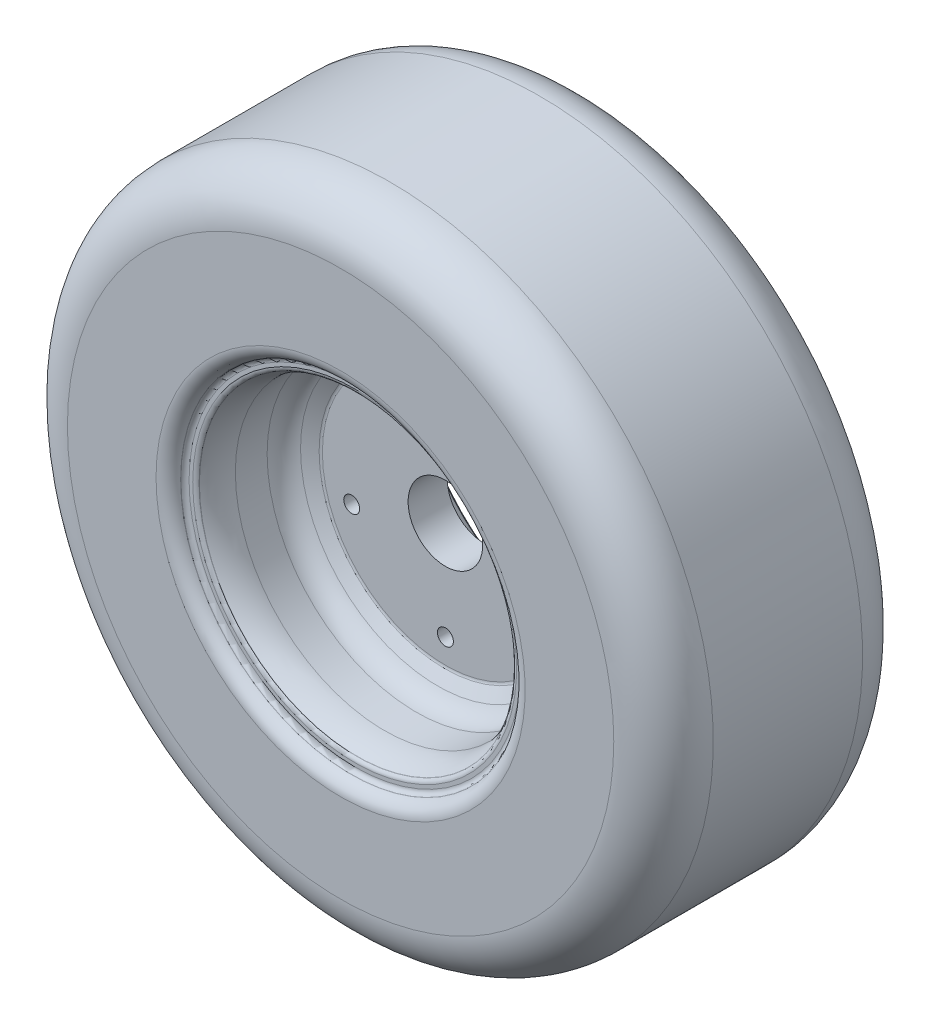
ISO-10303-21;
HEADER;
FILE_DESCRIPTION(('STEP AP214'),'2;1');
FILE_NAME('part.step','',(''),(''),'','','');
FILE_SCHEMA(('AUTOMOTIVE_DESIGN { 1 0 10303 214 1 1 1 1 }'));
ENDSEC;
DATA;
#1=APPLICATION_CONTEXT('core data for automotive mechanical design processes');
#2=APPLICATION_PROTOCOL_DEFINITION('international standard','automotive_design',2000,#1);
#3=PRODUCT_CONTEXT('',#1,'mechanical');
#4=PRODUCT('Part','Part','',(#3));
#5=PRODUCT_RELATED_PRODUCT_CATEGORY('part','',(#4));
#6=PRODUCT_DEFINITION_FORMATION('','',#4);
#7=PRODUCT_DEFINITION_CONTEXT('part definition',#1,'design');
#8=PRODUCT_DEFINITION('design','',#6,#7);
#9=PRODUCT_DEFINITION_SHAPE('','',#8);
#10=(LENGTH_UNIT() NAMED_UNIT(*) SI_UNIT(.MILLI.,.METRE.));
#11=(NAMED_UNIT(*) PLANE_ANGLE_UNIT() SI_UNIT($,.RADIAN.));
#12=(NAMED_UNIT(*) SI_UNIT($,.STERADIAN.) SOLID_ANGLE_UNIT());
#13=UNCERTAINTY_MEASURE_WITH_UNIT(LENGTH_MEASURE(1.E-05),#10,'distance_accuracy_value','');
#14=(GEOMETRIC_REPRESENTATION_CONTEXT(3) GLOBAL_UNCERTAINTY_ASSIGNED_CONTEXT((#13)) GLOBAL_UNIT_ASSIGNED_CONTEXT((#10,
#11,#12)) REPRESENTATION_CONTEXT('',''));
#15=CARTESIAN_POINT('',(0.,0.,0.));
#16=DIRECTION('',(0.,0.,1.));
#17=DIRECTION('',(1.,0.,0.));
#18=AXIS2_PLACEMENT_3D('',#15,#16,#17);
#19=CARTESIAN_POINT('',(0.,0.,-38.1));
#20=DIRECTION('',(0.,0.,-1.));
#21=DIRECTION('',(-1.,0.,0.));
#22=AXIS2_PLACEMENT_3D('',#19,#20,#21);
#23=TOROIDAL_SURFACE('',#22,139.446,25.4);
#24=CARTESIAN_POINT('',(0.,0.,-38.1));
#25=DIRECTION('',(0.,0.,-1.));
#26=DIRECTION('',(-1.,0.,0.));
#27=AXIS2_PLACEMENT_3D('',#24,#25,#26);
#28=CIRCLE('',#27,164.846);
#29=CARTESIAN_POINT('',(-164.846,0.,-38.1));
#30=VERTEX_POINT('',#29);
#31=EDGE_CURVE('E174',#30,#30,#28,.T.);
#32=ORIENTED_EDGE('',*,*,#31,.T.);
#33=EDGE_LOOP('',(#32));
#34=FACE_BOUND('',#33,.T.);
#35=CARTESIAN_POINT('',(0.,0.,-63.5));
#36=DIRECTION('',(0.,0.,-1.));
#37=DIRECTION('',(-1.,0.,0.));
#38=AXIS2_PLACEMENT_3D('',#35,#36,#37);
#39=CIRCLE('',#38,139.446);
#40=CARTESIAN_POINT('',(-139.446,0.,-63.5));
#41=VERTEX_POINT('',#40);
#42=EDGE_CURVE('E171',#41,#41,#39,.T.);
#43=ORIENTED_EDGE('',*,*,#42,.F.);
#44=EDGE_LOOP('',(#43));
#45=FACE_BOUND('',#44,.T.);
#46=ADVANCED_FACE('F38',(#34,#45),#23,.T.);
#47=CARTESIAN_POINT('',(0.,139.446,-63.5));
#48=DIRECTION('',(0.,0.,-1.));
#49=DIRECTION('',(-1.,0.,0.));
#50=AXIS2_PLACEMENT_3D('',#47,#48,#49);
#51=PLANE('',#50);
#52=ORIENTED_EDGE('',*,*,#42,.T.);
#53=EDGE_LOOP('',(#52));
#54=FACE_BOUND('',#53,.T.);
#55=CARTESIAN_POINT('',(0.,0.,-63.5));
#56=DIRECTION('',(0.,0.,-1.));
#57=DIRECTION('',(-1.,0.,0.));
#58=AXIS2_PLACEMENT_3D('',#55,#56,#57);
#59=CIRCLE('',#58,94.2120877153265);
#60=CARTESIAN_POINT('',(-94.2120877153265,0.,-63.5));
#61=VERTEX_POINT('',#60);
#62=EDGE_CURVE('E168',#61,#61,#59,.T.);
#63=ORIENTED_EDGE('',*,*,#62,.F.);
#64=EDGE_LOOP('',(#63));
#65=FACE_BOUND('',#64,.T.);
#66=ADVANCED_FACE('F231',(#54,#65),#51,.T.);
#67=CARTESIAN_POINT('',(0.,0.,-55.88));
#68=DIRECTION('',(0.,0.,-1.));
#69=DIRECTION('',(-1.,0.,0.));
#70=AXIS2_PLACEMENT_3D('',#67,#68,#69);
#71=TOROIDAL_SURFACE('',#70,94.2120877153265,7.62);
#72=ORIENTED_EDGE('',*,*,#62,.T.);
#73=EDGE_LOOP('',(#72));
#74=FACE_BOUND('',#73,.T.);
#75=CARTESIAN_POINT('',(0.,0.,-58.1976065714329));
#76=DIRECTION('',(0.,0.,-1.));
#77=DIRECTION('',(-1.,0.,0.));
#78=AXIS2_PLACEMENT_3D('',#75,#76,#77);
#79=CIRCLE('',#78,86.9530864217565);
#80=CARTESIAN_POINT('',(-86.9530864217565,0.,-58.1976065714329));
#81=VERTEX_POINT('',#80);
#82=EDGE_CURVE('E165',#81,#81,#79,.T.);
#83=ORIENTED_EDGE('',*,*,#82,.F.);
#84=EDGE_LOOP('',(#83));
#85=FACE_BOUND('',#84,.T.);
#86=ADVANCED_FACE('F235',(#74,#85),#71,.T.);
#87=CARTESIAN_POINT('',(0.,0.,-58.1074584761891));
#88=DIRECTION('',(0.,0.,-1.));
#89=DIRECTION('',(-1.,0.,0.));
#90=AXIS2_PLACEMENT_3D('',#87,#88,#89);
#91=CONICAL_SURFACE('',#90,86.9243045260811,0.309043766679178);
#92=ORIENTED_EDGE('',*,*,#82,.T.);
#93=EDGE_LOOP('',(#92));
#94=FACE_BOUND('',#93,.T.);
#95=CARTESIAN_POINT('',(0.,0.,-58.1074584761891));
#96=DIRECTION('',(0.,0.,-1.));
#97=DIRECTION('',(-1.,0.,0.));
#98=AXIS2_PLACEMENT_3D('',#95,#96,#97);
#99=CIRCLE('',#98,86.9243045260811);
#100=CARTESIAN_POINT('',(-86.9243045260811,0.,-58.1074584761891));
#101=VERTEX_POINT('',#100);
#102=EDGE_CURVE('E162',#101,#101,#99,.T.);
#103=ORIENTED_EDGE('',*,*,#102,.F.);
#104=EDGE_LOOP('',(#103));
#105=FACE_BOUND('',#104,.T.);
#106=ADVANCED_FACE('F239',(#94,#105),#91,.F.);
#107=CARTESIAN_POINT('',(0.,0.,-58.879994));
#108=DIRECTION('',(0.,0.,-1.));
#109=DIRECTION('',(-1.,0.,0.));
#110=AXIS2_PLACEMENT_3D('',#107,#108,#109);
#111=TOROIDAL_SURFACE('',#110,84.5046374282244,2.54000000000001);
#112=ORIENTED_EDGE('',*,*,#102,.T.);
#113=EDGE_LOOP('',(#112));
#114=FACE_BOUND('',#113,.T.);
#115=CARTESIAN_POINT('',(0.,0.,-56.339994));
#116=DIRECTION('',(0.,0.,-1.));
#117=DIRECTION('',(-1.,0.,0.));
#118=AXIS2_PLACEMENT_3D('',#115,#116,#117);
#119=CIRCLE('',#118,84.5046374282244);
#120=CARTESIAN_POINT('',(-84.5046374282244,0.,-56.339994));
#121=VERTEX_POINT('',#120);
#122=EDGE_CURVE('E159',#121,#121,#119,.T.);
#123=ORIENTED_EDGE('',*,*,#122,.F.);
#124=EDGE_LOOP('',(#123));
#125=FACE_BOUND('',#124,.T.);
#126=ADVANCED_FACE('F243',(#114,#125),#111,.F.);
#127=CARTESIAN_POINT('',(0.,84.5046374282244,-56.339994));
#128=DIRECTION('',(0.,0.,-1.));
#129=DIRECTION('',(-1.,0.,0.));
#130=AXIS2_PLACEMENT_3D('',#127,#128,#129);
#131=PLANE('',#130);
#132=ORIENTED_EDGE('',*,*,#122,.T.);
#133=EDGE_LOOP('',(#132));
#134=FACE_BOUND('',#133,.T.);
#135=CARTESIAN_POINT('',(0.,0.,-56.339994));
#136=DIRECTION('',(0.,0.,-1.));
#137=DIRECTION('',(-1.,0.,0.));
#138=AXIS2_PLACEMENT_3D('',#135,#136,#137);
#139=CIRCLE('',#138,82.6393667465595);
#140=CARTESIAN_POINT('',(-82.6393667465595,0.,-56.339994));
#141=VERTEX_POINT('',#140);
#142=EDGE_CURVE('E156',#141,#141,#139,.T.);
#143=ORIENTED_EDGE('',*,*,#142,.F.);
#144=EDGE_LOOP('',(#143));
#145=FACE_BOUND('',#144,.T.);
#146=ADVANCED_FACE('F247',(#134,#145),#131,.T.);
#147=CARTESIAN_POINT('',(0.,0.,-53.799994));
#148=DIRECTION('',(0.,0.,-1.));
#149=DIRECTION('',(-1.,0.,0.));
#150=AXIS2_PLACEMENT_3D('',#147,#148,#149);
#151=TOROIDAL_SURFACE('',#150,82.6393667465595,2.53999999999999);
#152=ORIENTED_EDGE('',*,*,#142,.T.);
#153=EDGE_LOOP('',(#152));
#154=FACE_BOUND('',#153,.T.);
#155=CARTESIAN_POINT('',(0.,0.,-55.2089324984121));
#156=DIRECTION('',(0.,0.,-1.));
#157=DIRECTION('',(-1.,0.,0.));
#158=AXIS2_PLACEMENT_3D('',#155,#156,#157);
#159=CIRCLE('',#158,80.5259589989414);
#160=CARTESIAN_POINT('',(-80.5259589989414,0.,-55.2089324984121));
#161=VERTEX_POINT('',#160);
#162=EDGE_CURVE('E153',#161,#161,#159,.T.);
#163=ORIENTED_EDGE('',*,*,#162,.F.);
#164=EDGE_LOOP('',(#163));
#165=FACE_BOUND('',#164,.T.);
#166=ADVANCED_FACE('F251',(#154,#165),#151,.T.);
#167=CARTESIAN_POINT('',(0.,0.,-55.1188777857282));
#168=DIRECTION('',(0.,0.,-1.));
#169=DIRECTION('',(-1.,0.,0.));
#170=AXIS2_PLACEMENT_3D('',#167,#168,#169);
#171=CONICAL_SURFACE('',#170,80.4659225238188,0.588002603547674);
#172=ORIENTED_EDGE('',*,*,#162,.T.);
#173=EDGE_LOOP('',(#172));
#174=FACE_BOUND('',#173,.T.);
#175=CARTESIAN_POINT('',(0.,0.,-55.1188777857282));
#176=DIRECTION('',(0.,0.,-1.));
#177=DIRECTION('',(-1.,0.,0.));
#178=AXIS2_PLACEMENT_3D('',#175,#176,#177);
#179=CIRCLE('',#178,80.4659225238188);
#180=CARTESIAN_POINT('',(-80.4659225238188,0.,-55.1188777857282));
#181=VERTEX_POINT('',#180);
#182=EDGE_CURVE('E150',#181,#181,#179,.T.);
#183=ORIENTED_EDGE('',*,*,#182,.F.);
#184=EDGE_LOOP('',(#183));
#185=FACE_BOUND('',#184,.T.);
#186=ADVANCED_FACE('F255',(#174,#185),#171,.F.);
#187=CARTESIAN_POINT('',(0.,0.,-41.0294928016074));
#188=DIRECTION('',(0.,0.,-1.));
#189=DIRECTION('',(-1.,0.,0.));
#190=AXIS2_PLACEMENT_3D('',#187,#188,#189);
#191=TOROIDAL_SURFACE('',#190,101.6,25.4);
#192=ORIENTED_EDGE('',*,*,#182,.T.);
#193=EDGE_LOOP('',(#192));
#194=FACE_BOUND('',#193,.T.);
#195=CARTESIAN_POINT('',(0.,0.,-41.0294928016074));
#196=DIRECTION('',(0.,0.,-1.));
#197=DIRECTION('',(-1.,0.,0.));
#198=AXIS2_PLACEMENT_3D('',#195,#196,#197);
#199=CIRCLE('',#198,76.2);
#200=CARTESIAN_POINT('',(-76.2,0.,-41.0294928016074));
#201=VERTEX_POINT('',#200);
#202=EDGE_CURVE('E147',#201,#201,#199,.T.);
#203=ORIENTED_EDGE('',*,*,#202,.F.);
#204=EDGE_LOOP('',(#203));
#205=FACE_BOUND('',#204,.T.);
#206=ADVANCED_FACE('F259',(#194,#205),#191,.T.);
#207=CARTESIAN_POINT('',(0.,0.,-76.2));
#208=DIRECTION('',(0.,0.,-1.));
#209=DIRECTION('',(-1.,0.,0.));
#210=AXIS2_PLACEMENT_3D('',#207,#208,#209);
#211=CYLINDRICAL_SURFACE('',#210,76.2);
#212=ORIENTED_EDGE('',*,*,#202,.T.);
#213=EDGE_LOOP('',(#212));
#214=FACE_BOUND('',#213,.T.);
#215=CARTESIAN_POINT('',(0.,0.,-24.8106178129071));
#216=DIRECTION('',(0.,0.,-1.));
#217=DIRECTION('',(-1.,0.,0.));
#218=AXIS2_PLACEMENT_3D('',#215,#216,#217);
#219=CIRCLE('',#218,76.2);
#220=CARTESIAN_POINT('',(-76.2,0.,-24.8106178129071));
#221=VERTEX_POINT('',#220);
#222=EDGE_CURVE('E144',#221,#221,#219,.T.);
#223=ORIENTED_EDGE('',*,*,#222,.F.);
#224=EDGE_LOOP('',(#223));
#225=FACE_BOUND('',#224,.T.);
#226=ADVANCED_FACE('F263',(#214,#225),#211,.F.);
#227=CARTESIAN_POINT('',(0.,0.,-24.8106178129071));
#228=DIRECTION('',(0.,0.,-1.));
#229=DIRECTION('',(-1.,0.,0.));
#230=AXIS2_PLACEMENT_3D('',#227,#228,#229);
#231=TOROIDAL_SURFACE('',#230,63.5,12.7);
#232=ORIENTED_EDGE('',*,*,#222,.T.);
#233=EDGE_LOOP('',(#232));
#234=FACE_BOUND('',#233,.T.);
#235=CARTESIAN_POINT('',(0.,0.,-13.9204576563578));
#236=DIRECTION('',(0.,0.,-1.));
#237=DIRECTION('',(-1.,0.,0.));
#238=AXIS2_PLACEMENT_3D('',#235,#236,#237);
#239=CIRCLE('',#238,70.0340960939296);
#240=CARTESIAN_POINT('',(-70.0340960939296,0.,-13.9204576563578));
#241=VERTEX_POINT('',#240);
#242=EDGE_CURVE('E141',#241,#241,#239,.T.);
#243=ORIENTED_EDGE('',*,*,#242,.F.);
#244=EDGE_LOOP('',(#243));
#245=FACE_BOUND('',#244,.T.);
#246=ADVANCED_FACE('F267',(#234,#245),#231,.F.);
#247=CARTESIAN_POINT('',(0.,0.,-10.3619679686901));
#248=DIRECTION('',(0.,0.,-1.));
#249=DIRECTION('',(-1.,0.,0.));
#250=AXIS2_PLACEMENT_3D('',#247,#248,#249);
#251=CONICAL_SURFACE('',#250,64.1032799478169,1.03037682652431);
#252=ORIENTED_EDGE('',*,*,#242,.T.);
#253=EDGE_LOOP('',(#252));
#254=FACE_BOUND('',#253,.T.);
#255=CARTESIAN_POINT('',(0.,0.,-10.3619679686901));
#256=DIRECTION('',(0.,0.,-1.));
#257=DIRECTION('',(-1.,0.,0.));
#258=AXIS2_PLACEMENT_3D('',#255,#256,#257);
#259=CIRCLE('',#258,64.1032799478169);
#260=CARTESIAN_POINT('',(-64.1032799478169,0.,-10.3619679686901));
#261=VERTEX_POINT('',#260);
#262=EDGE_CURVE('E138',#261,#261,#259,.T.);
#263=ORIENTED_EDGE('',*,*,#262,.F.);
#264=EDGE_LOOP('',(#263));
#265=FACE_BOUND('',#264,.T.);
#266=ADVANCED_FACE('F271',(#254,#265),#251,.F.);
#267=CARTESIAN_POINT('',(0.,0.,-12.54));
#268=DIRECTION('',(0.,0.,-1.));
#269=DIRECTION('',(-1.,0.,0.));
#270=AXIS2_PLACEMENT_3D('',#267,#268,#269);
#271=TOROIDAL_SURFACE('',#270,62.796460729031,2.54);
#272=ORIENTED_EDGE('',*,*,#262,.T.);
#273=EDGE_LOOP('',(#272));
#274=FACE_BOUND('',#273,.T.);
#275=CARTESIAN_POINT('',(0.,0.,-10.));
#276=DIRECTION('',(0.,0.,-1.));
#277=DIRECTION('',(-1.,0.,0.));
#278=AXIS2_PLACEMENT_3D('',#275,#276,#277);
#279=CIRCLE('',#278,62.796460729031);
#280=CARTESIAN_POINT('',(-62.796460729031,0.,-10.));
#281=VERTEX_POINT('',#280);
#282=EDGE_CURVE('E135',#281,#281,#279,.T.);
#283=ORIENTED_EDGE('',*,*,#282,.F.);
#284=EDGE_LOOP('',(#283));
#285=FACE_BOUND('',#284,.T.);
#286=ADVANCED_FACE('F275',(#274,#285),#271,.F.);
#287=CARTESIAN_POINT('',(0.,0.,-10.));
#288=DIRECTION('',(0.,0.,-1.));
#289=DIRECTION('',(-1.,0.,0.));
#290=AXIS2_PLACEMENT_3D('',#287,#288,#289);
#291=PLANE('',#290);
#292=CARTESIAN_POINT('',(-47.8305343175157,-15.5410826811054,-10.));
#293=DIRECTION('',(0.,0.,-1.));
#294=DIRECTION('',(-1.,0.,0.));
#295=AXIS2_PLACEMENT_3D('',#292,#293,#294);
#296=CIRCLE('',#295,4.064);
#297=CARTESIAN_POINT('',(-51.8945343175157,-15.5410826811054,-10.));
#298=VERTEX_POINT('',#297);
#299=EDGE_CURVE('E74',#298,#298,#296,.T.);
#300=ORIENTED_EDGE('',*,*,#299,.F.);
#301=EDGE_LOOP('',(#300));
#302=FACE_BOUND('',#301,.T.);
#303=CARTESIAN_POINT('',(-29.5608959082934,40.6870826811046,-10.));
#304=DIRECTION('',(0.,0.,-1.));
#305=DIRECTION('',(-1.,0.,0.));
#306=AXIS2_PLACEMENT_3D('',#303,#304,#305);
#307=CIRCLE('',#306,4.064);
#308=CARTESIAN_POINT('',(-33.6248959082934,40.6870826811046,-10.));
#309=VERTEX_POINT('',#308);
#310=EDGE_CURVE('E71',#309,#309,#307,.T.);
#311=ORIENTED_EDGE('',*,*,#310,.F.);
#312=EDGE_LOOP('',(#311));
#313=FACE_BOUND('',#312,.T.);
#314=CARTESIAN_POINT('',(29.5608959082928,40.687082681105,-10.));
#315=DIRECTION('',(0.,0.,-1.));
#316=DIRECTION('',(-1.,0.,0.));
#317=AXIS2_PLACEMENT_3D('',#314,#315,#316);
#318=CIRCLE('',#317,4.064);
#319=CARTESIAN_POINT('',(25.4968959082928,40.687082681105,-10.));
#320=VERTEX_POINT('',#319);
#321=EDGE_CURVE('E68',#320,#320,#318,.T.);
#322=ORIENTED_EDGE('',*,*,#321,.F.);
#323=EDGE_LOOP('',(#322));
#324=FACE_BOUND('',#323,.T.);
#325=CARTESIAN_POINT('',(47.8305343175159,-15.5410826811047,-10.));
#326=DIRECTION('',(0.,0.,-1.));
#327=DIRECTION('',(-1.,0.,0.));
#328=AXIS2_PLACEMENT_3D('',#325,#326,#327);
#329=CIRCLE('',#328,4.064);
#330=CARTESIAN_POINT('',(43.7665343175159,-15.5410826811047,-10.));
#331=VERTEX_POINT('',#330);
#332=EDGE_CURVE('E64',#331,#331,#329,.T.);
#333=ORIENTED_EDGE('',*,*,#332,.F.);
#334=EDGE_LOOP('',(#333));
#335=FACE_BOUND('',#334,.T.);
#336=CARTESIAN_POINT('',(0.,-50.292,-10.));
#337=DIRECTION('',(0.,0.,-1.));
#338=DIRECTION('',(-1.,0.,0.));
#339=AXIS2_PLACEMENT_3D('',#336,#337,#338);
#340=CIRCLE('',#339,4.064);
#341=CARTESIAN_POINT('',(-4.064,-50.292,-10.));
#342=VERTEX_POINT('',#341);
#343=EDGE_CURVE('E60',#342,#342,#340,.T.);
#344=ORIENTED_EDGE('',*,*,#343,.F.);
#345=EDGE_LOOP('',(#344));
#346=FACE_BOUND('',#345,.T.);
#347=CARTESIAN_POINT('',(0.,0.,-10.));
#348=DIRECTION('',(0.,0.,-1.));
#349=DIRECTION('',(-1.,0.,0.));
#350=AXIS2_PLACEMENT_3D('',#347,#348,#349);
#351=CIRCLE('',#350,19.05);
#352=CARTESIAN_POINT('',(-19.05,0.,-10.));
#353=VERTEX_POINT('',#352);
#354=EDGE_CURVE('E59',#353,#353,#351,.T.);
#355=ORIENTED_EDGE('',*,*,#354,.F.);
#356=EDGE_LOOP('',(#355));
#357=FACE_BOUND('',#356,.T.);
#358=ORIENTED_EDGE('',*,*,#282,.T.);
#359=EDGE_LOOP('',(#358));
#360=FACE_BOUND('',#359,.T.);
#361=ADVANCED_FACE('F279',(#302,#313,#324,#335,#346,#357,#360),#291,.T.);
#362=CARTESIAN_POINT('',(0.,0.,9.99999999999999));
#363=DIRECTION('',(0.,0.,1.));
#364=DIRECTION('',(1.,0.,0.));
#365=AXIS2_PLACEMENT_3D('',#362,#363,#364);
#366=PLANE('',#365);
#367=CARTESIAN_POINT('',(-47.8305343175157,-15.5410826811054,9.99999999999999));
#368=DIRECTION('',(0.,0.,1.));
#369=DIRECTION('',(1.,0.,0.));
#370=AXIS2_PLACEMENT_3D('',#367,#368,#369);
#371=CIRCLE('',#370,4.064);
#372=CARTESIAN_POINT('',(-43.7665343175157,-15.5410826811054,9.99999999999999));
#373=VERTEX_POINT('',#372);
#374=EDGE_CURVE('E42',#373,#373,#371,.T.);
#375=ORIENTED_EDGE('',*,*,#374,.F.);
#376=EDGE_LOOP('',(#375));
#377=FACE_BOUND('',#376,.T.);
#378=CARTESIAN_POINT('',(-29.5608959082934,40.6870826811046,9.99999999999999));
#379=DIRECTION('',(0.,0.,1.));
#380=DIRECTION('',(1.,0.,0.));
#381=AXIS2_PLACEMENT_3D('',#378,#379,#380);
#382=CIRCLE('',#381,4.064);
#383=CARTESIAN_POINT('',(-25.4968959082934,40.6870826811046,9.99999999999999));
#384=VERTEX_POINT('',#383);
#385=EDGE_CURVE('E72',#384,#384,#382,.T.);
#386=ORIENTED_EDGE('',*,*,#385,.F.);
#387=EDGE_LOOP('',(#386));
#388=FACE_BOUND('',#387,.T.);
#389=CARTESIAN_POINT('',(29.5608959082928,40.687082681105,9.99999999999999));
#390=DIRECTION('',(0.,0.,1.));
#391=DIRECTION('',(1.,0.,0.));
#392=AXIS2_PLACEMENT_3D('',#389,#390,#391);
#393=CIRCLE('',#392,4.064);
#394=CARTESIAN_POINT('',(33.6248959082928,40.687082681105,9.99999999999999));
#395=VERTEX_POINT('',#394);
#396=EDGE_CURVE('E69',#395,#395,#393,.T.);
#397=ORIENTED_EDGE('',*,*,#396,.F.);
#398=EDGE_LOOP('',(#397));
#399=FACE_BOUND('',#398,.T.);
#400=CARTESIAN_POINT('',(47.8305343175159,-15.5410826811047,9.99999999999999));
#401=DIRECTION('',(0.,0.,1.));
#402=DIRECTION('',(1.,0.,0.));
#403=AXIS2_PLACEMENT_3D('',#400,#401,#402);
#404=CIRCLE('',#403,4.064);
#405=CARTESIAN_POINT('',(51.8945343175159,-15.5410826811047,9.99999999999999));
#406=VERTEX_POINT('',#405);
#407=EDGE_CURVE('E65',#406,#406,#404,.T.);
#408=ORIENTED_EDGE('',*,*,#407,.F.);
#409=EDGE_LOOP('',(#408));
#410=FACE_BOUND('',#409,.T.);
#411=CARTESIAN_POINT('',(0.,-50.292,9.99999999999999));
#412=DIRECTION('',(0.,0.,1.));
#413=DIRECTION('',(1.,0.,0.));
#414=AXIS2_PLACEMENT_3D('',#411,#412,#413);
#415=CIRCLE('',#414,4.064);
#416=CARTESIAN_POINT('',(4.064,-50.292,9.99999999999999));
#417=VERTEX_POINT('',#416);
#418=EDGE_CURVE('E61',#417,#417,#415,.T.);
#419=ORIENTED_EDGE('',*,*,#418,.F.);
#420=EDGE_LOOP('',(#419));
#421=FACE_BOUND('',#420,.T.);
#422=CARTESIAN_POINT('',(0.,0.,9.99999999999999));
#423=DIRECTION('',(0.,0.,1.));
#424=DIRECTION('',(1.,0.,0.));
#425=AXIS2_PLACEMENT_3D('',#422,#423,#424);
#426=CIRCLE('',#425,19.05);
#427=CARTESIAN_POINT('',(19.05,0.,9.99999999999999));
#428=VERTEX_POINT('',#427);
#429=EDGE_CURVE('E56',#428,#428,#426,.T.);
#430=ORIENTED_EDGE('',*,*,#429,.F.);
#431=EDGE_LOOP('',(#430));
#432=FACE_BOUND('',#431,.T.);
#433=CARTESIAN_POINT('',(0.,0.,9.99999999999999));
#434=DIRECTION('',(0.,0.,-1.));
#435=DIRECTION('',(-1.,0.,0.));
#436=AXIS2_PLACEMENT_3D('',#433,#434,#435);
#437=CIRCLE('',#436,62.796460729031);
#438=CARTESIAN_POINT('',(-62.796460729031,0.,9.99999999999999));
#439=VERTEX_POINT('',#438);
#440=EDGE_CURVE('E132',#439,#439,#437,.T.);
#441=ORIENTED_EDGE('',*,*,#440,.F.);
#442=EDGE_LOOP('',(#441));
#443=FACE_BOUND('',#442,.T.);
#444=ADVANCED_FACE('F283',(#377,#388,#399,#410,#421,#432,#443),#366,.T.);
#445=CARTESIAN_POINT('',(0.,0.,12.54));
#446=DIRECTION('',(0.,0.,-1.));
#447=DIRECTION('',(-1.,0.,0.));
#448=AXIS2_PLACEMENT_3D('',#445,#446,#447);
#449=TOROIDAL_SURFACE('',#448,62.796460729031,2.54);
#450=ORIENTED_EDGE('',*,*,#440,.T.);
#451=EDGE_LOOP('',(#450));
#452=FACE_BOUND('',#451,.T.);
#453=CARTESIAN_POINT('',(0.,0.,10.3619679686901));
#454=DIRECTION('',(0.,0.,-1.));
#455=DIRECTION('',(-1.,0.,0.));
#456=AXIS2_PLACEMENT_3D('',#453,#454,#455);
#457=CIRCLE('',#456,64.1032799478169);
#458=CARTESIAN_POINT('',(-64.1032799478169,0.,10.3619679686901));
#459=VERTEX_POINT('',#458);
#460=EDGE_CURVE('E129',#459,#459,#457,.T.);
#461=ORIENTED_EDGE('',*,*,#460,.F.);
#462=EDGE_LOOP('',(#461));
#463=FACE_BOUND('',#462,.T.);
#464=ADVANCED_FACE('F287',(#452,#463),#449,.F.);
#465=CARTESIAN_POINT('',(0.,0.,13.9204576563577));
#466=DIRECTION('',(0.,0.,1.));
#467=DIRECTION('',(1.,0.,0.));
#468=AXIS2_PLACEMENT_3D('',#465,#466,#467);
#469=CONICAL_SURFACE('',#468,70.0340960939296,1.03037682652431);
#470=ORIENTED_EDGE('',*,*,#460,.T.);
#471=EDGE_LOOP('',(#470));
#472=FACE_BOUND('',#471,.T.);
#473=CARTESIAN_POINT('',(0.,0.,13.9204576563577));
#474=DIRECTION('',(0.,0.,-1.));
#475=DIRECTION('',(-1.,0.,0.));
#476=AXIS2_PLACEMENT_3D('',#473,#474,#475);
#477=CIRCLE('',#476,70.0340960939296);
#478=CARTESIAN_POINT('',(-70.0340960939296,0.,13.9204576563577));
#479=VERTEX_POINT('',#478);
#480=EDGE_CURVE('E126',#479,#479,#477,.T.);
#481=ORIENTED_EDGE('',*,*,#480,.F.);
#482=EDGE_LOOP('',(#481));
#483=FACE_BOUND('',#482,.T.);
#484=ADVANCED_FACE('F291',(#472,#483),#469,.F.);
#485=CARTESIAN_POINT('',(0.,0.,24.810617812907));
#486=DIRECTION('',(0.,0.,-1.));
#487=DIRECTION('',(-1.,0.,0.));
#488=AXIS2_PLACEMENT_3D('',#485,#486,#487);
#489=TOROIDAL_SURFACE('',#488,63.5,12.7);
#490=ORIENTED_EDGE('',*,*,#480,.T.);
#491=EDGE_LOOP('',(#490));
#492=FACE_BOUND('',#491,.T.);
#493=CARTESIAN_POINT('',(0.,0.,24.8106178129071));
#494=DIRECTION('',(0.,0.,-1.));
#495=DIRECTION('',(-1.,0.,0.));
#496=AXIS2_PLACEMENT_3D('',#493,#494,#495);
#497=CIRCLE('',#496,76.2);
#498=CARTESIAN_POINT('',(-76.2,0.,24.8106178129071));
#499=VERTEX_POINT('',#498);
#500=EDGE_CURVE('E123',#499,#499,#497,.T.);
#501=ORIENTED_EDGE('',*,*,#500,.F.);
#502=EDGE_LOOP('',(#501));
#503=FACE_BOUND('',#502,.T.);
#504=ADVANCED_FACE('F295',(#492,#503),#489,.F.);
#505=CARTESIAN_POINT('',(0.,0.,-76.2));
#506=DIRECTION('',(0.,0.,-1.));
#507=DIRECTION('',(-1.,0.,0.));
#508=AXIS2_PLACEMENT_3D('',#505,#506,#507);
#509=CYLINDRICAL_SURFACE('',#508,76.2);
#510=ORIENTED_EDGE('',*,*,#500,.T.);
#511=EDGE_LOOP('',(#510));
#512=FACE_BOUND('',#511,.T.);
#513=CARTESIAN_POINT('',(0.,0.,41.0294928016074));
#514=DIRECTION('',(0.,0.,-1.));
#515=DIRECTION('',(-1.,0.,0.));
#516=AXIS2_PLACEMENT_3D('',#513,#514,#515);
#517=CIRCLE('',#516,76.2);
#518=CARTESIAN_POINT('',(-76.2,0.,41.0294928016074));
#519=VERTEX_POINT('',#518);
#520=EDGE_CURVE('E120',#519,#519,#517,.T.);
#521=ORIENTED_EDGE('',*,*,#520,.F.);
#522=EDGE_LOOP('',(#521));
#523=FACE_BOUND('',#522,.T.);
#524=ADVANCED_FACE('F299',(#512,#523),#509,.F.);
#525=CARTESIAN_POINT('',(0.,0.,41.0294928016074));
#526=DIRECTION('',(0.,0.,-1.));
#527=DIRECTION('',(-1.,0.,0.));
#528=AXIS2_PLACEMENT_3D('',#525,#526,#527);
#529=TOROIDAL_SURFACE('',#528,101.6,25.4);
#530=ORIENTED_EDGE('',*,*,#520,.T.);
#531=EDGE_LOOP('',(#530));
#532=FACE_BOUND('',#531,.T.);
#533=CARTESIAN_POINT('',(0.,0.,55.1188777857282));
#534=DIRECTION('',(0.,0.,-1.));
#535=DIRECTION('',(-1.,0.,0.));
#536=AXIS2_PLACEMENT_3D('',#533,#534,#535);
#537=CIRCLE('',#536,80.4659225238188);
#538=CARTESIAN_POINT('',(-80.4659225238188,0.,55.1188777857282));
#539=VERTEX_POINT('',#538);
#540=EDGE_CURVE('E117',#539,#539,#537,.T.);
#541=ORIENTED_EDGE('',*,*,#540,.F.);
#542=EDGE_LOOP('',(#541));
#543=FACE_BOUND('',#542,.T.);
#544=ADVANCED_FACE('F303',(#532,#543),#529,.T.);
#545=CARTESIAN_POINT('',(0.,0.,55.2089324984121));
#546=DIRECTION('',(0.,0.,1.));
#547=DIRECTION('',(1.,0.,0.));
#548=AXIS2_PLACEMENT_3D('',#545,#546,#547);
#549=CONICAL_SURFACE('',#548,80.5259589989414,0.58800260354771);
#550=ORIENTED_EDGE('',*,*,#540,.T.);
#551=EDGE_LOOP('',(#550));
#552=FACE_BOUND('',#551,.T.);
#553=CARTESIAN_POINT('',(0.,0.,55.2089324984121));
#554=DIRECTION('',(0.,0.,-1.));
#555=DIRECTION('',(-1.,0.,0.));
#556=AXIS2_PLACEMENT_3D('',#553,#554,#555);
#557=CIRCLE('',#556,80.5259589989414);
#558=CARTESIAN_POINT('',(-80.5259589989414,0.,55.2089324984121));
#559=VERTEX_POINT('',#558);
#560=EDGE_CURVE('E114',#559,#559,#557,.T.);
#561=ORIENTED_EDGE('',*,*,#560,.F.);
#562=EDGE_LOOP('',(#561));
#563=FACE_BOUND('',#562,.T.);
#564=ADVANCED_FACE('F307',(#552,#563),#549,.F.);
#565=CARTESIAN_POINT('',(0.,0.,53.799994));
#566=DIRECTION('',(0.,0.,-1.));
#567=DIRECTION('',(-1.,0.,0.));
#568=AXIS2_PLACEMENT_3D('',#565,#566,#567);
#569=TOROIDAL_SURFACE('',#568,82.6393667465595,2.54);
#570=ORIENTED_EDGE('',*,*,#560,.T.);
#571=EDGE_LOOP('',(#570));
#572=FACE_BOUND('',#571,.T.);
#573=CARTESIAN_POINT('',(0.,0.,56.339994));
#574=DIRECTION('',(0.,0.,-1.));
#575=DIRECTION('',(-1.,0.,0.));
#576=AXIS2_PLACEMENT_3D('',#573,#574,#575);
#577=CIRCLE('',#576,82.6393667465595);
#578=CARTESIAN_POINT('',(-82.6393667465595,0.,56.339994));
#579=VERTEX_POINT('',#578);
#580=EDGE_CURVE('E111',#579,#579,#577,.T.);
#581=ORIENTED_EDGE('',*,*,#580,.F.);
#582=EDGE_LOOP('',(#581));
#583=FACE_BOUND('',#582,.T.);
#584=ADVANCED_FACE('F311',(#572,#583),#569,.T.);
#585=CARTESIAN_POINT('',(0.,84.5046374282244,56.339994));
#586=DIRECTION('',(0.,0.,1.));
#587=DIRECTION('',(1.,0.,0.));
#588=AXIS2_PLACEMENT_3D('',#585,#586,#587);
#589=PLANE('',#588);
#590=ORIENTED_EDGE('',*,*,#580,.T.);
#591=EDGE_LOOP('',(#590));
#592=FACE_BOUND('',#591,.T.);
#593=CARTESIAN_POINT('',(0.,0.,56.339994));
#594=DIRECTION('',(0.,0.,-1.));
#595=DIRECTION('',(-1.,0.,0.));
#596=AXIS2_PLACEMENT_3D('',#593,#594,#595);
#597=CIRCLE('',#596,84.5046374282244);
#598=CARTESIAN_POINT('',(-84.5046374282244,0.,56.339994));
#599=VERTEX_POINT('',#598);
#600=EDGE_CURVE('E108',#599,#599,#597,.T.);
#601=ORIENTED_EDGE('',*,*,#600,.F.);
#602=EDGE_LOOP('',(#601));
#603=FACE_BOUND('',#602,.T.);
#604=ADVANCED_FACE('F315',(#592,#603),#589,.T.);
#605=CARTESIAN_POINT('',(0.,0.,58.879994));
#606=DIRECTION('',(0.,0.,-1.));
#607=DIRECTION('',(-1.,0.,0.));
#608=AXIS2_PLACEMENT_3D('',#605,#606,#607);
#609=TOROIDAL_SURFACE('',#608,84.5046374282244,2.54000000000001);
#610=ORIENTED_EDGE('',*,*,#600,.T.);
#611=EDGE_LOOP('',(#610));
#612=FACE_BOUND('',#611,.T.);
#613=CARTESIAN_POINT('',(0.,0.,58.107458476189));
#614=DIRECTION('',(0.,0.,-1.));
#615=DIRECTION('',(-1.,0.,0.));
#616=AXIS2_PLACEMENT_3D('',#613,#614,#615);
#617=CIRCLE('',#616,86.9243045260811);
#618=CARTESIAN_POINT('',(-86.9243045260811,0.,58.107458476189));
#619=VERTEX_POINT('',#618);
#620=EDGE_CURVE('E105',#619,#619,#617,.T.);
#621=ORIENTED_EDGE('',*,*,#620,.F.);
#622=EDGE_LOOP('',(#621));
#623=FACE_BOUND('',#622,.T.);
#624=ADVANCED_FACE('F319',(#612,#623),#609,.F.);
#625=CARTESIAN_POINT('',(0.,0.,58.1976065714328));
#626=DIRECTION('',(0.,0.,1.));
#627=DIRECTION('',(1.,0.,0.));
#628=AXIS2_PLACEMENT_3D('',#625,#626,#627);
#629=CONICAL_SURFACE('',#628,86.9530864217565,0.309043766679082);
#630=ORIENTED_EDGE('',*,*,#620,.T.);
#631=EDGE_LOOP('',(#630));
#632=FACE_BOUND('',#631,.T.);
#633=CARTESIAN_POINT('',(0.,0.,58.1976065714328));
#634=DIRECTION('',(0.,0.,-1.));
#635=DIRECTION('',(-1.,0.,0.));
#636=AXIS2_PLACEMENT_3D('',#633,#634,#635);
#637=CIRCLE('',#636,86.9530864217565);
#638=CARTESIAN_POINT('',(-86.9530864217565,0.,58.1976065714328));
#639=VERTEX_POINT('',#638);
#640=EDGE_CURVE('E102',#639,#639,#637,.T.);
#641=ORIENTED_EDGE('',*,*,#640,.F.);
#642=EDGE_LOOP('',(#641));
#643=FACE_BOUND('',#642,.T.);
#644=ADVANCED_FACE('F323',(#632,#643),#629,.F.);
#645=CARTESIAN_POINT('',(0.,0.,55.88));
#646=DIRECTION('',(0.,0.,-1.));
#647=DIRECTION('',(-1.,0.,0.));
#648=AXIS2_PLACEMENT_3D('',#645,#646,#647);
#649=TOROIDAL_SURFACE('',#648,94.2120877153265,7.61999999999999);
#650=ORIENTED_EDGE('',*,*,#640,.T.);
#651=EDGE_LOOP('',(#650));
#652=FACE_BOUND('',#651,.T.);
#653=CARTESIAN_POINT('',(0.,0.,63.5));
#654=DIRECTION('',(0.,0.,-1.));
#655=DIRECTION('',(-1.,0.,0.));
#656=AXIS2_PLACEMENT_3D('',#653,#654,#655);
#657=CIRCLE('',#656,94.2120877153265);
#658=CARTESIAN_POINT('',(-94.2120877153265,0.,63.5));
#659=VERTEX_POINT('',#658);
#660=EDGE_CURVE('E99',#659,#659,#657,.T.);
#661=ORIENTED_EDGE('',*,*,#660,.F.);
#662=EDGE_LOOP('',(#661));
#663=FACE_BOUND('',#662,.T.);
#664=ADVANCED_FACE('F327',(#652,#663),#649,.T.);
#665=CARTESIAN_POINT('',(0.,139.446,63.5));
#666=DIRECTION('',(0.,0.,1.));
#667=DIRECTION('',(1.,0.,0.));
#668=AXIS2_PLACEMENT_3D('',#665,#666,#667);
#669=PLANE('',#668);
#670=ORIENTED_EDGE('',*,*,#660,.T.);
#671=EDGE_LOOP('',(#670));
#672=FACE_BOUND('',#671,.T.);
#673=CARTESIAN_POINT('',(0.,0.,63.5));
#674=DIRECTION('',(0.,0.,-1.));
#675=DIRECTION('',(-1.,0.,0.));
#676=AXIS2_PLACEMENT_3D('',#673,#674,#675);
#677=CIRCLE('',#676,139.446);
#678=CARTESIAN_POINT('',(-139.446,0.,63.5));
#679=VERTEX_POINT('',#678);
#680=EDGE_CURVE('E96',#679,#679,#677,.T.);
#681=ORIENTED_EDGE('',*,*,#680,.F.);
#682=EDGE_LOOP('',(#681));
#683=FACE_BOUND('',#682,.T.);
#684=ADVANCED_FACE('F331',(#672,#683),#669,.T.);
#685=CARTESIAN_POINT('',(0.,0.,38.1));
#686=DIRECTION('',(0.,0.,-1.));
#687=DIRECTION('',(-1.,0.,0.));
#688=AXIS2_PLACEMENT_3D('',#685,#686,#687);
#689=TOROIDAL_SURFACE('',#688,139.446,25.4);
#690=ORIENTED_EDGE('',*,*,#680,.T.);
#691=EDGE_LOOP('',(#690));
#692=FACE_BOUND('',#691,.T.);
#693=CARTESIAN_POINT('',(0.,0.,38.1));
#694=DIRECTION('',(0.,0.,-1.));
#695=DIRECTION('',(-1.,0.,0.));
#696=AXIS2_PLACEMENT_3D('',#693,#694,#695);
#697=CIRCLE('',#696,164.846);
#698=CARTESIAN_POINT('',(-164.846,0.,38.1));
#699=VERTEX_POINT('',#698);
#700=EDGE_CURVE('E93',#699,#699,#697,.T.);
#701=ORIENTED_EDGE('',*,*,#700,.F.);
#702=EDGE_LOOP('',(#701));
#703=FACE_BOUND('',#702,.T.);
#704=ADVANCED_FACE('F335',(#692,#703),#689,.T.);
#705=CARTESIAN_POINT('',(0.,0.,-76.2));
#706=DIRECTION('',(0.,0.,-1.));
#707=DIRECTION('',(-1.,0.,0.));
#708=AXIS2_PLACEMENT_3D('',#705,#706,#707);
#709=CYLINDRICAL_SURFACE('',#708,164.846);
#710=ORIENTED_EDGE('',*,*,#700,.T.);
#711=EDGE_LOOP('',(#710));
#712=FACE_BOUND('',#711,.T.);
#713=ORIENTED_EDGE('',*,*,#31,.F.);
#714=EDGE_LOOP('',(#713));
#715=FACE_BOUND('',#714,.T.);
#716=ADVANCED_FACE('F339',(#712,#715),#709,.T.);
#717=CARTESIAN_POINT('',(0.,0.,63.5));
#718=DIRECTION('',(0.,0.,-1.));
#719=DIRECTION('',(-1.,0.,0.));
#720=AXIS2_PLACEMENT_3D('',#717,#718,#719);
#721=CYLINDRICAL_SURFACE('',#720,19.05);
#722=ORIENTED_EDGE('',*,*,#354,.T.);
#723=EDGE_LOOP('',(#722));
#724=FACE_BOUND('',#723,.T.);
#725=ORIENTED_EDGE('',*,*,#429,.T.);
#726=EDGE_LOOP('',(#725));
#727=FACE_BOUND('',#726,.T.);
#728=ADVANCED_FACE('F343',(#724,#727),#721,.F.);
#729=CARTESIAN_POINT('',(0.,-50.292,63.5));
#730=DIRECTION('',(0.,0.,-1.));
#731=DIRECTION('',(-1.,0.,0.));
#732=AXIS2_PLACEMENT_3D('',#729,#730,#731);
#733=CYLINDRICAL_SURFACE('',#732,4.064);
#734=ORIENTED_EDGE('',*,*,#343,.T.);
#735=EDGE_LOOP('',(#734));
#736=FACE_BOUND('',#735,.T.);
#737=ORIENTED_EDGE('',*,*,#418,.T.);
#738=EDGE_LOOP('',(#737));
#739=FACE_BOUND('',#738,.T.);
#740=ADVANCED_FACE('F347',(#736,#739),#733,.F.);
#741=CARTESIAN_POINT('',(47.8305343175159,-15.5410826811047,63.5));
#742=DIRECTION('',(0.,0.,-1.));
#743=DIRECTION('',(-1.,0.,0.));
#744=AXIS2_PLACEMENT_3D('',#741,#742,#743);
#745=CYLINDRICAL_SURFACE('',#744,4.064);
#746=ORIENTED_EDGE('',*,*,#332,.T.);
#747=EDGE_LOOP('',(#746));
#748=FACE_BOUND('',#747,.T.);
#749=ORIENTED_EDGE('',*,*,#407,.T.);
#750=EDGE_LOOP('',(#749));
#751=FACE_BOUND('',#750,.T.);
#752=ADVANCED_FACE('F351',(#748,#751),#745,.F.);
#753=CARTESIAN_POINT('',(29.5608959082928,40.687082681105,63.5));
#754=DIRECTION('',(0.,0.,-1.));
#755=DIRECTION('',(-1.,0.,0.));
#756=AXIS2_PLACEMENT_3D('',#753,#754,#755);
#757=CYLINDRICAL_SURFACE('',#756,4.064);
#758=ORIENTED_EDGE('',*,*,#321,.T.);
#759=EDGE_LOOP('',(#758));
#760=FACE_BOUND('',#759,.T.);
#761=ORIENTED_EDGE('',*,*,#396,.T.);
#762=EDGE_LOOP('',(#761));
#763=FACE_BOUND('',#762,.T.);
#764=ADVANCED_FACE('F355',(#760,#763),#757,.F.);
#765=CARTESIAN_POINT('',(-29.5608959082934,40.6870826811046,63.5));
#766=DIRECTION('',(0.,0.,-1.));
#767=DIRECTION('',(-1.,0.,0.));
#768=AXIS2_PLACEMENT_3D('',#765,#766,#767);
#769=CYLINDRICAL_SURFACE('',#768,4.064);
#770=ORIENTED_EDGE('',*,*,#310,.T.);
#771=EDGE_LOOP('',(#770));
#772=FACE_BOUND('',#771,.T.);
#773=ORIENTED_EDGE('',*,*,#385,.T.);
#774=EDGE_LOOP('',(#773));
#775=FACE_BOUND('',#774,.T.);
#776=ADVANCED_FACE('F359',(#772,#775),#769,.F.);
#777=CARTESIAN_POINT('',(-47.8305343175157,-15.5410826811054,63.5));
#778=DIRECTION('',(0.,0.,-1.));
#779=DIRECTION('',(-1.,0.,0.));
#780=AXIS2_PLACEMENT_3D('',#777,#778,#779);
#781=CYLINDRICAL_SURFACE('',#780,4.064);
#782=ORIENTED_EDGE('',*,*,#299,.T.);
#783=EDGE_LOOP('',(#782));
#784=FACE_BOUND('',#783,.T.);
#785=ORIENTED_EDGE('',*,*,#374,.T.);
#786=EDGE_LOOP('',(#785));
#787=FACE_BOUND('',#786,.T.);
#788=ADVANCED_FACE('F363',(#784,#787),#781,.F.);
#789=CLOSED_SHELL('',(#46,#66,#86,#106,#126,#146,#166,#186,#206,#226,#246,#266,#286,#361,#444,
#464,#484,#504,#524,#544,#564,#584,#604,#624,#644,#664,#684,#704,#716,#728,#740,#752,#764,#776,#788));
#790=CARTESIAN_POINT('',(0.,0.,40.18));
#791=DIRECTION('',(0.,0.,-1.));
#792=DIRECTION('',(-1.,0.,0.));
#793=AXIS2_PLACEMENT_3D('',#790,#791,#792);
#794=TOROIDAL_SURFACE('',#793,100.845958998941,20.32);
#795=CARTESIAN_POINT('',(0.,0.,40.18));
#796=DIRECTION('',(0.,0.,-1.));
#797=DIRECTION('',(-1.,0.,0.));
#798=AXIS2_PLACEMENT_3D('',#795,#796,#797);
#799=CIRCLE('',#798,80.5259589989414);
#800=CARTESIAN_POINT('',(-80.5259589989414,0.,40.18));
#801=VERTEX_POINT('',#800);
#802=EDGE_CURVE('E10',#801,#801,#799,.T.);
#803=ORIENTED_EDGE('',*,*,#802,.F.);
#804=EDGE_LOOP('',(#803));
#805=FACE_BOUND('',#804,.T.);
#806=CARTESIAN_POINT('',(0.,0.,60.5));
#807=DIRECTION('',(0.,0.,-1.));
#808=DIRECTION('',(-1.,0.,0.));
#809=AXIS2_PLACEMENT_3D('',#806,#807,#808);
#810=CIRCLE('',#809,100.845958998941);
#811=CARTESIAN_POINT('',(-100.845958998941,0.,60.5));
#812=VERTEX_POINT('',#811);
#813=EDGE_CURVE('E177',#812,#812,#810,.T.);
#814=ORIENTED_EDGE('',*,*,#813,.T.);
#815=EDGE_LOOP('',(#814));
#816=FACE_BOUND('',#815,.T.);
#817=ADVANCED_FACE('F40',(#805,#816),#794,.F.);
#818=CARTESIAN_POINT('',(0.,0.,-76.2));
#819=DIRECTION('',(0.,0.,-1.));
#820=DIRECTION('',(-1.,0.,0.));
#821=AXIS2_PLACEMENT_3D('',#818,#819,#820);
#822=CYLINDRICAL_SURFACE('',#821,80.5259589989414);
#823=CARTESIAN_POINT('',(0.,0.,-40.18));
#824=DIRECTION('',(0.,0.,-1.));
#825=DIRECTION('',(-1.,0.,0.));
#826=AXIS2_PLACEMENT_3D('',#823,#824,#825);
#827=CIRCLE('',#826,80.5259589989414);
#828=CARTESIAN_POINT('',(-80.5259589989414,0.,-40.18));
#829=VERTEX_POINT('',#828);
#830=EDGE_CURVE('E47',#829,#829,#827,.T.);
#831=ORIENTED_EDGE('',*,*,#830,.F.);
#832=EDGE_LOOP('',(#831));
#833=FACE_BOUND('',#832,.T.);
#834=ORIENTED_EDGE('',*,*,#802,.T.);
#835=EDGE_LOOP('',(#834));
#836=FACE_BOUND('',#835,.T.);
#837=ADVANCED_FACE('F199',(#833,#836),#822,.T.);
#838=CARTESIAN_POINT('',(0.,0.,-40.18));
#839=DIRECTION('',(0.,0.,-1.));
#840=DIRECTION('',(-1.,0.,0.));
#841=AXIS2_PLACEMENT_3D('',#838,#839,#840);
#842=TOROIDAL_SURFACE('',#841,100.845958998941,20.32);
#843=CARTESIAN_POINT('',(0.,0.,-60.5));
#844=DIRECTION('',(0.,0.,-1.));
#845=DIRECTION('',(-1.,0.,0.));
#846=AXIS2_PLACEMENT_3D('',#843,#844,#845);
#847=CIRCLE('',#846,100.845958998941);
#848=CARTESIAN_POINT('',(-100.845958998941,0.,-60.5));
#849=VERTEX_POINT('',#848);
#850=EDGE_CURVE('E52',#849,#849,#847,.T.);
#851=ORIENTED_EDGE('',*,*,#850,.F.);
#852=EDGE_LOOP('',(#851));
#853=FACE_BOUND('',#852,.T.);
#854=ORIENTED_EDGE('',*,*,#830,.T.);
#855=EDGE_LOOP('',(#854));
#856=FACE_BOUND('',#855,.T.);
#857=ADVANCED_FACE('F196',(#853,#856),#842,.F.);
#858=CARTESIAN_POINT('',(0.,140.689772599543,-60.5));
#859=DIRECTION('',(0.,0.,-1.));
#860=DIRECTION('',(-1.,0.,0.));
#861=AXIS2_PLACEMENT_3D('',#858,#859,#860);
#862=PLANE('',#861);
#863=CARTESIAN_POINT('',(0.,0.,-60.5));
#864=DIRECTION('',(0.,0.,-1.));
#865=DIRECTION('',(-1.,0.,0.));
#866=AXIS2_PLACEMENT_3D('',#863,#864,#865);
#867=CIRCLE('',#866,140.689772599543);
#868=CARTESIAN_POINT('',(-140.689772599543,0.,-60.5));
#869=VERTEX_POINT('',#868);
#870=EDGE_CURVE('E189',#869,#869,#867,.T.);
#871=ORIENTED_EDGE('',*,*,#870,.F.);
#872=EDGE_LOOP('',(#871));
#873=FACE_BOUND('',#872,.T.);
#874=ORIENTED_EDGE('',*,*,#850,.T.);
#875=EDGE_LOOP('',(#874));
#876=FACE_BOUND('',#875,.T.);
#877=ADVANCED_FACE('F194',(#873,#876),#862,.F.);
#878=CARTESIAN_POINT('',(0.,0.,-40.18));
#879=DIRECTION('',(0.,0.,-1.));
#880=DIRECTION('',(-1.,0.,0.));
#881=AXIS2_PLACEMENT_3D('',#878,#879,#880);
#882=TOROIDAL_SURFACE('',#881,140.689772599543,20.32);
#883=CARTESIAN_POINT('',(0.,0.,-40.18));
#884=DIRECTION('',(0.,0.,-1.));
#885=DIRECTION('',(-1.,0.,0.));
#886=AXIS2_PLACEMENT_3D('',#883,#884,#885);
#887=CIRCLE('',#886,161.009772599543);
#888=CARTESIAN_POINT('',(-161.009772599543,0.,-40.18));
#889=VERTEX_POINT('',#888);
#890=EDGE_CURVE('E186',#889,#889,#887,.T.);
#891=ORIENTED_EDGE('',*,*,#890,.F.);
#892=EDGE_LOOP('',(#891));
#893=FACE_BOUND('',#892,.T.);
#894=ORIENTED_EDGE('',*,*,#870,.T.);
#895=EDGE_LOOP('',(#894));
#896=FACE_BOUND('',#895,.T.);
#897=ADVANCED_FACE('F212',(#893,#896),#882,.F.);
#898=CARTESIAN_POINT('',(0.,0.,-76.2));
#899=DIRECTION('',(0.,0.,-1.));
#900=DIRECTION('',(-1.,0.,0.));
#901=AXIS2_PLACEMENT_3D('',#898,#899,#900);
#902=CYLINDRICAL_SURFACE('',#901,161.009772599543);
#903=CARTESIAN_POINT('',(0.,0.,40.18));
#904=DIRECTION('',(0.,0.,-1.));
#905=DIRECTION('',(-1.,0.,0.));
#906=AXIS2_PLACEMENT_3D('',#903,#904,#905);
#907=CIRCLE('',#906,161.009772599543);
#908=CARTESIAN_POINT('',(-161.009772599543,0.,40.18));
#909=VERTEX_POINT('',#908);
#910=EDGE_CURVE('E183',#909,#909,#907,.T.);
#911=ORIENTED_EDGE('',*,*,#910,.F.);
#912=EDGE_LOOP('',(#911));
#913=FACE_BOUND('',#912,.T.);
#914=ORIENTED_EDGE('',*,*,#890,.T.);
#915=EDGE_LOOP('',(#914));
#916=FACE_BOUND('',#915,.T.);
#917=ADVANCED_FACE('F216',(#913,#916),#902,.F.);
#918=CARTESIAN_POINT('',(0.,0.,40.18));
#919=DIRECTION('',(0.,0.,-1.));
#920=DIRECTION('',(-1.,0.,0.));
#921=AXIS2_PLACEMENT_3D('',#918,#919,#920);
#922=TOROIDAL_SURFACE('',#921,140.689772599543,20.32);
#923=CARTESIAN_POINT('',(0.,0.,60.5));
#924=DIRECTION('',(0.,0.,-1.));
#925=DIRECTION('',(-1.,0.,0.));
#926=AXIS2_PLACEMENT_3D('',#923,#924,#925);
#927=CIRCLE('',#926,140.689772599543);
#928=CARTESIAN_POINT('',(-140.689772599543,0.,60.5));
#929=VERTEX_POINT('',#928);
#930=EDGE_CURVE('E180',#929,#929,#927,.T.);
#931=ORIENTED_EDGE('',*,*,#930,.F.);
#932=EDGE_LOOP('',(#931));
#933=FACE_BOUND('',#932,.T.);
#934=ORIENTED_EDGE('',*,*,#910,.T.);
#935=EDGE_LOOP('',(#934));
#936=FACE_BOUND('',#935,.T.);
#937=ADVANCED_FACE('F220',(#933,#936),#922,.F.);
#938=CARTESIAN_POINT('',(0.,140.689772599543,60.5));
#939=DIRECTION('',(0.,0.,1.));
#940=DIRECTION('',(1.,0.,0.));
#941=AXIS2_PLACEMENT_3D('',#938,#939,#940);
#942=PLANE('',#941);
#943=ORIENTED_EDGE('',*,*,#813,.F.);
#944=EDGE_LOOP('',(#943));
#945=FACE_BOUND('',#944,.T.);
#946=ORIENTED_EDGE('',*,*,#930,.T.);
#947=EDGE_LOOP('',(#946));
#948=FACE_BOUND('',#947,.T.);
#949=ADVANCED_FACE('F224',(#945,#948),#942,.F.);
#950=CLOSED_SHELL('',(#817,#837,#857,#877,#897,#917,#937,#949));
#951=ORIENTED_CLOSED_SHELL('',*,#950,.T.);
#952=BREP_WITH_VOIDS('B2',#789,(#951));
#953=ADVANCED_BREP_SHAPE_REPRESENTATION('',(#18,#952),#14);
#954=SHAPE_DEFINITION_REPRESENTATION(#9,#953);
ENDSEC;
END-ISO-10303-21;
